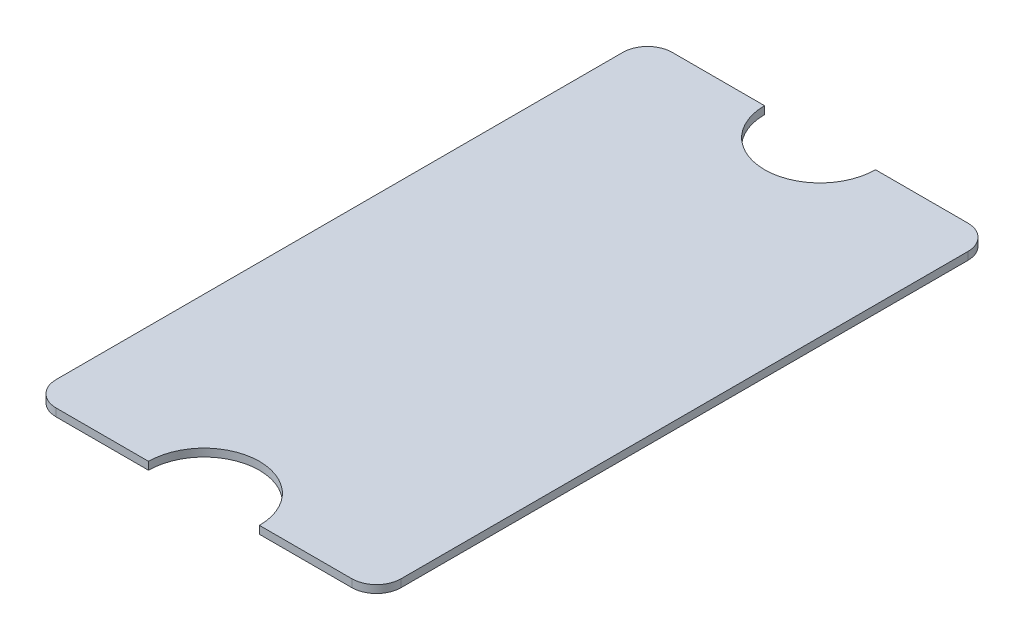
ISO-10303-21;
HEADER;
FILE_DESCRIPTION(('STEP AP214'),'2;1');
FILE_NAME('part.step','',(''),(''),'','','');
FILE_SCHEMA(('AUTOMOTIVE_DESIGN { 1 0 10303 214 1 1 1 1 }'));
ENDSEC;
DATA;
#1=APPLICATION_CONTEXT('core data for automotive mechanical design processes');
#2=APPLICATION_PROTOCOL_DEFINITION('international standard','automotive_design',2000,#1);
#3=PRODUCT_CONTEXT('',#1,'mechanical');
#4=PRODUCT('Part','Part','',(#3));
#5=PRODUCT_RELATED_PRODUCT_CATEGORY('part','',(#4));
#6=PRODUCT_DEFINITION_FORMATION('','',#4);
#7=PRODUCT_DEFINITION_CONTEXT('part definition',#1,'design');
#8=PRODUCT_DEFINITION('design','',#6,#7);
#9=PRODUCT_DEFINITION_SHAPE('','',#8);
#10=(LENGTH_UNIT() NAMED_UNIT(*) SI_UNIT(.MILLI.,.METRE.));
#11=(NAMED_UNIT(*) PLANE_ANGLE_UNIT() SI_UNIT($,.RADIAN.));
#12=(NAMED_UNIT(*) SI_UNIT($,.STERADIAN.) SOLID_ANGLE_UNIT());
#13=UNCERTAINTY_MEASURE_WITH_UNIT(LENGTH_MEASURE(1.E-05),#10,'distance_accuracy_value','');
#14=(GEOMETRIC_REPRESENTATION_CONTEXT(3) GLOBAL_UNCERTAINTY_ASSIGNED_CONTEXT((#13)) GLOBAL_UNIT_ASSIGNED_CONTEXT((#10,
#11,#12)) REPRESENTATION_CONTEXT('',''));
#15=CARTESIAN_POINT('',(0.,0.,0.));
#16=DIRECTION('',(0.,0.,1.));
#17=DIRECTION('',(1.,0.,0.));
#18=AXIS2_PLACEMENT_3D('',#15,#16,#17);
#19=CARTESIAN_POINT('',(0.601078804943356,-0.63,0.));
#20=DIRECTION('',(0.,1.,0.));
#21=DIRECTION('',(0.,0.,1.));
#22=AXIS2_PLACEMENT_3D('',#19,#20,#21);
#23=CYLINDRICAL_SURFACE('',#22,4.5);
#24=CARTESIAN_POINT('',(0.601078804943356,0.,0.));
#25=DIRECTION('',(0.,1.,0.));
#26=DIRECTION('',(0.,0.,1.));
#27=AXIS2_PLACEMENT_3D('',#24,#25,#26);
#28=CIRCLE('',#27,4.5);
#29=CARTESIAN_POINT('',(5.10107880494336,0.,-1.01156062692898E-13));
#30=VERTEX_POINT('',#29);
#31=CARTESIAN_POINT('',(-3.89892119505664,0.,0.));
#32=VERTEX_POINT('',#31);
#33=EDGE_CURVE('E169',#30,#32,#28,.T.);
#34=ORIENTED_EDGE('',*,*,#33,.T.);
#35=DIRECTION('',(0.,1.,0.));
#36=VECTOR('',#35,1.);
#37=CARTESIAN_POINT('',(-3.89892119505664,-0.63,0.));
#38=LINE('',#37,#36);
#39=CARTESIAN_POINT('',(-3.89892119505664,-0.63,0.));
#40=VERTEX_POINT('',#39);
#41=EDGE_CURVE('E152',#40,#32,#38,.T.);
#42=ORIENTED_EDGE('',*,*,#41,.F.);
#43=CARTESIAN_POINT('',(0.601078804943356,-0.63,0.));
#44=DIRECTION('',(0.,1.,0.));
#45=DIRECTION('',(0.,0.,1.));
#46=AXIS2_PLACEMENT_3D('',#43,#44,#45);
#47=CIRCLE('',#46,4.5);
#48=CARTESIAN_POINT('',(5.10107880494336,-0.63,-1.01156062692898E-13));
#49=VERTEX_POINT('',#48);
#50=EDGE_CURVE('E133',#49,#40,#47,.T.);
#51=ORIENTED_EDGE('',*,*,#50,.F.);
#52=DIRECTION('',(0.,1.,0.));
#53=VECTOR('',#52,1.);
#54=CARTESIAN_POINT('',(5.10107880494336,-0.63,-1.01156062692898E-13));
#55=LINE('',#54,#53);
#56=EDGE_CURVE('E142',#49,#30,#55,.T.);
#57=ORIENTED_EDGE('',*,*,#56,.T.);
#58=EDGE_LOOP('',(#34,#42,#51,#57));
#59=FACE_BOUND('',#58,.T.);
#60=ADVANCED_FACE('F40',(#59),#23,.F.);
#61=CARTESIAN_POINT('',(0.,-0.63,0.));
#62=DIRECTION('',(0.,0.,-1.));
#63=DIRECTION('',(-1.,0.,0.));
#64=AXIS2_PLACEMENT_3D('',#61,#62,#63);
#65=PLANE('',#64);
#66=DIRECTION('',(-1.,0.,0.));
#67=VECTOR('',#66,1.);
#68=CARTESIAN_POINT('',(0.,0.,0.));
#69=LINE('',#68,#67);
#70=CARTESIAN_POINT('',(-11.3989211950564,0.,0.));
#71=VERTEX_POINT('',#70);
#72=EDGE_CURVE('E153',#32,#71,#69,.T.);
#73=ORIENTED_EDGE('',*,*,#72,.T.);
#74=DIRECTION('',(0.,1.,0.));
#75=VECTOR('',#74,1.);
#76=CARTESIAN_POINT('',(-11.3989211950564,-0.63,0.));
#77=LINE('',#76,#75);
#78=CARTESIAN_POINT('',(-11.3989211950564,-0.63,0.));
#79=VERTEX_POINT('',#78);
#80=EDGE_CURVE('E200',#71,#79,#77,.F.);
#81=ORIENTED_EDGE('',*,*,#80,.T.);
#82=DIRECTION('',(-1.,0.,0.));
#83=VECTOR('',#82,1.);
#84=CARTESIAN_POINT('',(0.,-0.63,0.));
#85=LINE('',#84,#83);
#86=EDGE_CURVE('E140',#40,#79,#85,.T.);
#87=ORIENTED_EDGE('',*,*,#86,.F.);
#88=ORIENTED_EDGE('',*,*,#41,.T.);
#89=EDGE_LOOP('',(#73,#81,#87,#88));
#90=FACE_BOUND('',#89,.T.);
#91=ADVANCED_FACE('F242',(#90),#65,.F.);
#92=CARTESIAN_POINT('',(-13.3989211950564,-0.63,0.));
#93=DIRECTION('',(-1.,0.,0.));
#94=DIRECTION('',(0.,0.,1.));
#95=AXIS2_PLACEMENT_3D('',#92,#93,#94);
#96=PLANE('',#95);
#97=DIRECTION('',(0.,0.,1.));
#98=VECTOR('',#97,1.);
#99=CARTESIAN_POINT('',(-13.3989211950564,-0.63,0.));
#100=LINE('',#99,#98);
#101=CARTESIAN_POINT('',(-13.3989211950564,-0.63,-48.));
#102=VERTEX_POINT('',#101);
#103=CARTESIAN_POINT('',(-13.3989211950564,-0.63,-2.00000000000001));
#104=VERTEX_POINT('',#103);
#105=EDGE_CURVE('E166',#102,#104,#100,.T.);
#106=ORIENTED_EDGE('',*,*,#105,.T.);
#107=DIRECTION('',(0.,1.,0.));
#108=VECTOR('',#107,1.);
#109=CARTESIAN_POINT('',(-13.3989211950564,0.,-2.00000000000001));
#110=LINE('',#109,#108);
#111=CARTESIAN_POINT('',(-13.3989211950564,0.,-2.00000000000001));
#112=VERTEX_POINT('',#111);
#113=EDGE_CURVE('E189',#104,#112,#110,.T.);
#114=ORIENTED_EDGE('',*,*,#113,.T.);
#115=DIRECTION('',(0.,0.,1.));
#116=VECTOR('',#115,1.);
#117=CARTESIAN_POINT('',(-13.3989211950564,0.,0.));
#118=LINE('',#117,#116);
#119=CARTESIAN_POINT('',(-13.3989211950564,0.,-48.));
#120=VERTEX_POINT('',#119);
#121=EDGE_CURVE('E156',#120,#112,#118,.T.);
#122=ORIENTED_EDGE('',*,*,#121,.F.);
#123=DIRECTION('',(0.,1.,0.));
#124=VECTOR('',#123,1.);
#125=CARTESIAN_POINT('',(-13.3989211950564,-0.63,-48.));
#126=LINE('',#125,#124);
#127=EDGE_CURVE('E183',#120,#102,#126,.F.);
#128=ORIENTED_EDGE('',*,*,#127,.T.);
#129=EDGE_LOOP('',(#106,#114,#122,#128));
#130=FACE_BOUND('',#129,.T.);
#131=ADVANCED_FACE('F247',(#130),#96,.T.);
#132=CARTESIAN_POINT('',(0.,-0.63,-50.));
#133=DIRECTION('',(0.,0.,-1.));
#134=DIRECTION('',(-1.,0.,0.));
#135=AXIS2_PLACEMENT_3D('',#132,#133,#134);
#136=PLANE('',#135);
#137=DIRECTION('',(-1.,0.,0.));
#138=VECTOR('',#137,1.);
#139=CARTESIAN_POINT('',(0.,-0.63,-50.));
#140=LINE('',#139,#138);
#141=CARTESIAN_POINT('',(-3.89892119505644,-0.63,-50.));
#142=VERTEX_POINT('',#141);
#143=CARTESIAN_POINT('',(-11.3989211950564,-0.63,-50.));
#144=VERTEX_POINT('',#143);
#145=EDGE_CURVE('E163',#142,#144,#140,.T.);
#146=ORIENTED_EDGE('',*,*,#145,.T.);
#147=DIRECTION('',(0.,1.,0.));
#148=VECTOR('',#147,1.);
#149=CARTESIAN_POINT('',(-11.3989211950564,-0.63,-50.));
#150=LINE('',#149,#148);
#151=CARTESIAN_POINT('',(-11.3989211950564,0.,-50.));
#152=VERTEX_POINT('',#151);
#153=EDGE_CURVE('E11',#144,#152,#150,.T.);
#154=ORIENTED_EDGE('',*,*,#153,.T.);
#155=DIRECTION('',(-1.,0.,0.));
#156=VECTOR('',#155,1.);
#157=CARTESIAN_POINT('',(0.,0.,-50.));
#158=LINE('',#157,#156);
#159=CARTESIAN_POINT('',(-3.89892119505644,0.,-50.));
#160=VERTEX_POINT('',#159);
#161=EDGE_CURVE('E177',#160,#152,#158,.T.);
#162=ORIENTED_EDGE('',*,*,#161,.F.);
#163=DIRECTION('',(0.,1.,0.));
#164=VECTOR('',#163,1.);
#165=CARTESIAN_POINT('',(-3.89892119505644,-0.63,-50.));
#166=LINE('',#165,#164);
#167=EDGE_CURVE('E184',#142,#160,#166,.T.);
#168=ORIENTED_EDGE('',*,*,#167,.F.);
#169=EDGE_LOOP('',(#146,#154,#162,#168));
#170=FACE_BOUND('',#169,.T.);
#171=ADVANCED_FACE('F256',(#170),#136,.T.);
#172=CARTESIAN_POINT('',(0.601078804943561,-0.63,-50.));
#173=DIRECTION('',(0.,1.,0.));
#174=DIRECTION('',(0.,0.,1.));
#175=AXIS2_PLACEMENT_3D('',#172,#173,#174);
#176=CYLINDRICAL_SURFACE('',#175,4.5);
#177=CARTESIAN_POINT('',(0.601078804943561,0.,-50.));
#178=DIRECTION('',(0.,1.,0.));
#179=DIRECTION('',(0.,0.,1.));
#180=AXIS2_PLACEMENT_3D('',#177,#178,#179);
#181=CIRCLE('',#180,4.5);
#182=CARTESIAN_POINT('',(5.10107880494356,0.,-50.));
#183=VERTEX_POINT('',#182);
#184=EDGE_CURVE('E176',#160,#183,#181,.T.);
#185=ORIENTED_EDGE('',*,*,#184,.T.);
#186=DIRECTION('',(0.,1.,0.));
#187=VECTOR('',#186,1.);
#188=CARTESIAN_POINT('',(5.10107880494356,-0.63,-50.));
#189=LINE('',#188,#187);
#190=CARTESIAN_POINT('',(5.10107880494356,-0.63,-50.));
#191=VERTEX_POINT('',#190);
#192=EDGE_CURVE('E149',#191,#183,#189,.T.);
#193=ORIENTED_EDGE('',*,*,#192,.F.);
#194=CARTESIAN_POINT('',(0.601078804943561,-0.63,-50.));
#195=DIRECTION('',(0.,1.,0.));
#196=DIRECTION('',(0.,0.,1.));
#197=AXIS2_PLACEMENT_3D('',#194,#195,#196);
#198=CIRCLE('',#197,4.5);
#199=EDGE_CURVE('E162',#142,#191,#198,.T.);
#200=ORIENTED_EDGE('',*,*,#199,.F.);
#201=ORIENTED_EDGE('',*,*,#167,.T.);
#202=EDGE_LOOP('',(#185,#193,#200,#201));
#203=FACE_BOUND('',#202,.T.);
#204=ADVANCED_FACE('F253',(#203),#176,.F.);
#205=CARTESIAN_POINT('',(12.6010788049436,0.,-50.));
#206=VERTEX_POINT('',#205);
#207=EDGE_CURVE('E174',#206,#183,#158,.T.);
#208=ORIENTED_EDGE('',*,*,#207,.F.);
#209=DIRECTION('',(0.,1.,0.));
#210=VECTOR('',#209,1.);
#211=CARTESIAN_POINT('',(12.6010788049436,-0.63,-50.));
#212=LINE('',#211,#210);
#213=CARTESIAN_POINT('',(12.6010788049436,-0.63,-50.));
#214=VERTEX_POINT('',#213);
#215=EDGE_CURVE('E48',#206,#214,#212,.F.);
#216=ORIENTED_EDGE('',*,*,#215,.T.);
#217=EDGE_CURVE('E160',#214,#191,#140,.T.);
#218=ORIENTED_EDGE('',*,*,#217,.T.);
#219=ORIENTED_EDGE('',*,*,#192,.T.);
#220=EDGE_LOOP('',(#208,#216,#218,#219));
#221=FACE_BOUND('',#220,.T.);
#222=ADVANCED_FACE('F217',(#221),#136,.T.);
#223=CARTESIAN_POINT('',(14.6010788049436,-0.63,0.));
#224=DIRECTION('',(1.,0.,0.));
#225=DIRECTION('',(0.,0.,-1.));
#226=AXIS2_PLACEMENT_3D('',#223,#224,#225);
#227=PLANE('',#226);
#228=DIRECTION('',(0.,0.,-1.));
#229=VECTOR('',#228,1.);
#230=CARTESIAN_POINT('',(14.6010788049436,0.,0.));
#231=LINE('',#230,#229);
#232=CARTESIAN_POINT('',(14.6010788049436,0.,-2.00000000000014));
#233=VERTEX_POINT('',#232);
#234=CARTESIAN_POINT('',(14.6010788049436,0.,-48.));
#235=VERTEX_POINT('',#234);
#236=EDGE_CURVE('E171',#233,#235,#231,.T.);
#237=ORIENTED_EDGE('',*,*,#236,.F.);
#238=DIRECTION('',(0.,1.,0.));
#239=VECTOR('',#238,1.);
#240=CARTESIAN_POINT('',(14.6010788049436,-0.63,-2.00000000000014));
#241=LINE('',#240,#239);
#242=CARTESIAN_POINT('',(14.6010788049436,-0.63,-2.00000000000014));
#243=VERTEX_POINT('',#242);
#244=EDGE_CURVE('E213',#233,#243,#241,.F.);
#245=ORIENTED_EDGE('',*,*,#244,.T.);
#246=DIRECTION('',(0.,0.,-1.));
#247=VECTOR('',#246,1.);
#248=CARTESIAN_POINT('',(14.6010788049436,-0.63,0.));
#249=LINE('',#248,#247);
#250=CARTESIAN_POINT('',(14.6010788049436,-0.63,-48.));
#251=VERTEX_POINT('',#250);
#252=EDGE_CURVE('E138',#243,#251,#249,.T.);
#253=ORIENTED_EDGE('',*,*,#252,.T.);
#254=DIRECTION('',(0.,1.,0.));
#255=VECTOR('',#254,1.);
#256=CARTESIAN_POINT('',(14.6010788049436,-0.63,-48.));
#257=LINE('',#256,#255);
#258=EDGE_CURVE('E210',#251,#235,#257,.T.);
#259=ORIENTED_EDGE('',*,*,#258,.T.);
#260=EDGE_LOOP('',(#237,#245,#253,#259));
#261=FACE_BOUND('',#260,.T.);
#262=ADVANCED_FACE('F226',(#261),#227,.T.);
#263=CARTESIAN_POINT('',(12.6010788049436,-0.63,-1.41813644161106E-13));
#264=VERTEX_POINT('',#263);
#265=EDGE_CURVE('E128',#264,#49,#85,.T.);
#266=ORIENTED_EDGE('',*,*,#265,.F.);
#267=DIRECTION('',(0.,1.,0.));
#268=VECTOR('',#267,1.);
#269=CARTESIAN_POINT('',(12.6010788049436,0.,-1.41813644161106E-13));
#270=LINE('',#269,#268);
#271=CARTESIAN_POINT('',(12.6010788049436,0.,-1.41813644161106E-13));
#272=VERTEX_POINT('',#271);
#273=EDGE_CURVE('E208',#264,#272,#270,.T.);
#274=ORIENTED_EDGE('',*,*,#273,.T.);
#275=EDGE_CURVE('E145',#272,#30,#69,.T.);
#276=ORIENTED_EDGE('',*,*,#275,.T.);
#277=ORIENTED_EDGE('',*,*,#56,.F.);
#278=EDGE_LOOP('',(#266,#274,#276,#277));
#279=FACE_BOUND('',#278,.T.);
#280=ADVANCED_FACE('F143',(#279),#65,.F.);
#281=CARTESIAN_POINT('',(0.,-0.63,0.));
#282=DIRECTION('',(0.,1.,0.));
#283=DIRECTION('',(0.,0.,1.));
#284=AXIS2_PLACEMENT_3D('',#281,#282,#283);
#285=PLANE('',#284);
#286=ORIENTED_EDGE('',*,*,#86,.T.);
#287=CARTESIAN_POINT('',(-11.3989211950564,-0.63,-2.00000000000001));
#288=DIRECTION('',(0.,1.,0.));
#289=DIRECTION('',(0.,0.,1.));
#290=AXIS2_PLACEMENT_3D('',#287,#288,#289);
#291=CIRCLE('',#290,2.);
#292=EDGE_CURVE('E206',#79,#104,#291,.F.);
#293=ORIENTED_EDGE('',*,*,#292,.T.);
#294=ORIENTED_EDGE('',*,*,#105,.F.);
#295=CARTESIAN_POINT('',(-11.3989211950564,-0.63,-48.));
#296=DIRECTION('',(0.,1.,0.));
#297=DIRECTION('',(0.,0.,1.));
#298=AXIS2_PLACEMENT_3D('',#295,#296,#297);
#299=CIRCLE('',#298,2.);
#300=EDGE_CURVE('E202',#102,#144,#299,.F.);
#301=ORIENTED_EDGE('',*,*,#300,.T.);
#302=ORIENTED_EDGE('',*,*,#145,.F.);
#303=ORIENTED_EDGE('',*,*,#199,.T.);
#304=ORIENTED_EDGE('',*,*,#217,.F.);
#305=CARTESIAN_POINT('',(12.6010788049436,-0.63,-48.));
#306=DIRECTION('',(0.,1.,0.));
#307=DIRECTION('',(0.,0.,1.));
#308=AXIS2_PLACEMENT_3D('',#305,#306,#307);
#309=CIRCLE('',#308,2.);
#310=EDGE_CURVE('E61',#214,#251,#309,.F.);
#311=ORIENTED_EDGE('',*,*,#310,.T.);
#312=ORIENTED_EDGE('',*,*,#252,.F.);
#313=CARTESIAN_POINT('',(12.6010788049436,-0.63,-2.00000000000014));
#314=DIRECTION('',(0.,1.,0.));
#315=DIRECTION('',(0.,0.,1.));
#316=AXIS2_PLACEMENT_3D('',#313,#314,#315);
#317=CIRCLE('',#316,2.);
#318=EDGE_CURVE('E55',#243,#264,#317,.F.);
#319=ORIENTED_EDGE('',*,*,#318,.T.);
#320=ORIENTED_EDGE('',*,*,#265,.T.);
#321=ORIENTED_EDGE('',*,*,#50,.T.);
#322=EDGE_LOOP('',(#286,#293,#294,#301,#302,#303,#304,#311,#312,#319,#320,#321));
#323=FACE_BOUND('',#322,.T.);
#324=ADVANCED_FACE('F131',(#323),#285,.F.);
#325=CARTESIAN_POINT('',(0.,0.,0.));
#326=DIRECTION('',(0.,1.,0.));
#327=DIRECTION('',(0.,0.,1.));
#328=AXIS2_PLACEMENT_3D('',#325,#326,#327);
#329=PLANE('',#328);
#330=ORIENTED_EDGE('',*,*,#121,.T.);
#331=CARTESIAN_POINT('',(-11.3989211950564,0.,-2.00000000000001));
#332=DIRECTION('',(0.,1.,0.));
#333=DIRECTION('',(0.,0.,1.));
#334=AXIS2_PLACEMENT_3D('',#331,#332,#333);
#335=CIRCLE('',#334,2.);
#336=EDGE_CURVE('E198',#112,#71,#335,.T.);
#337=ORIENTED_EDGE('',*,*,#336,.T.);
#338=ORIENTED_EDGE('',*,*,#72,.F.);
#339=ORIENTED_EDGE('',*,*,#33,.F.);
#340=ORIENTED_EDGE('',*,*,#275,.F.);
#341=CARTESIAN_POINT('',(12.6010788049436,0.,-2.00000000000014));
#342=DIRECTION('',(0.,1.,0.));
#343=DIRECTION('',(0.,0.,1.));
#344=AXIS2_PLACEMENT_3D('',#341,#342,#343);
#345=CIRCLE('',#344,2.);
#346=EDGE_CURVE('E196',#272,#233,#345,.T.);
#347=ORIENTED_EDGE('',*,*,#346,.T.);
#348=ORIENTED_EDGE('',*,*,#236,.T.);
#349=CARTESIAN_POINT('',(12.6010788049436,0.,-48.));
#350=DIRECTION('',(0.,1.,0.));
#351=DIRECTION('',(0.,0.,1.));
#352=AXIS2_PLACEMENT_3D('',#349,#350,#351);
#353=CIRCLE('',#352,2.);
#354=EDGE_CURVE('E194',#235,#206,#353,.T.);
#355=ORIENTED_EDGE('',*,*,#354,.T.);
#356=ORIENTED_EDGE('',*,*,#207,.T.);
#357=ORIENTED_EDGE('',*,*,#184,.F.);
#358=ORIENTED_EDGE('',*,*,#161,.T.);
#359=CARTESIAN_POINT('',(-11.3989211950564,0.,-48.));
#360=DIRECTION('',(0.,1.,0.));
#361=DIRECTION('',(0.,0.,1.));
#362=AXIS2_PLACEMENT_3D('',#359,#360,#361);
#363=CIRCLE('',#362,2.);
#364=EDGE_CURVE('E192',#152,#120,#363,.T.);
#365=ORIENTED_EDGE('',*,*,#364,.T.);
#366=EDGE_LOOP('',(#330,#337,#338,#339,#340,#347,#348,#355,#356,#357,#358,#365));
#367=FACE_BOUND('',#366,.T.);
#368=ADVANCED_FACE('F229',(#367),#329,.T.);
#369=CARTESIAN_POINT('',(-11.3989211950564,-0.63,-2.00000000000001));
#370=DIRECTION('',(0.,-1.,0.));
#371=DIRECTION('',(0.,0.,-1.));
#372=AXIS2_PLACEMENT_3D('',#369,#370,#371);
#373=CYLINDRICAL_SURFACE('',#372,2.);
#374=ORIENTED_EDGE('',*,*,#292,.F.);
#375=ORIENTED_EDGE('',*,*,#80,.F.);
#376=ORIENTED_EDGE('',*,*,#336,.F.);
#377=ORIENTED_EDGE('',*,*,#113,.F.);
#378=EDGE_LOOP('',(#374,#375,#376,#377));
#379=FACE_BOUND('',#378,.T.);
#380=ADVANCED_FACE('F233',(#379),#373,.T.);
#381=CARTESIAN_POINT('',(12.6010788049436,-0.63,-2.00000000000014));
#382=DIRECTION('',(0.,-1.,0.));
#383=DIRECTION('',(0.,0.,-1.));
#384=AXIS2_PLACEMENT_3D('',#381,#382,#383);
#385=CYLINDRICAL_SURFACE('',#384,2.);
#386=ORIENTED_EDGE('',*,*,#318,.F.);
#387=ORIENTED_EDGE('',*,*,#244,.F.);
#388=ORIENTED_EDGE('',*,*,#346,.F.);
#389=ORIENTED_EDGE('',*,*,#273,.F.);
#390=EDGE_LOOP('',(#386,#387,#388,#389));
#391=FACE_BOUND('',#390,.T.);
#392=ADVANCED_FACE('F231',(#391),#385,.T.);
#393=CARTESIAN_POINT('',(12.6010788049436,-0.63,-48.));
#394=DIRECTION('',(0.,1.,0.));
#395=DIRECTION('',(0.,0.,1.));
#396=AXIS2_PLACEMENT_3D('',#393,#394,#395);
#397=CYLINDRICAL_SURFACE('',#396,2.);
#398=ORIENTED_EDGE('',*,*,#310,.F.);
#399=ORIENTED_EDGE('',*,*,#215,.F.);
#400=ORIENTED_EDGE('',*,*,#354,.F.);
#401=ORIENTED_EDGE('',*,*,#258,.F.);
#402=EDGE_LOOP('',(#398,#399,#400,#401));
#403=FACE_BOUND('',#402,.T.);
#404=ADVANCED_FACE('F223',(#403),#397,.T.);
#405=CARTESIAN_POINT('',(-11.3989211950564,-0.63,-48.));
#406=DIRECTION('',(0.,1.,0.));
#407=DIRECTION('',(0.,0.,1.));
#408=AXIS2_PLACEMENT_3D('',#405,#406,#407);
#409=CYLINDRICAL_SURFACE('',#408,2.);
#410=ORIENTED_EDGE('',*,*,#300,.F.);
#411=ORIENTED_EDGE('',*,*,#127,.F.);
#412=ORIENTED_EDGE('',*,*,#364,.F.);
#413=ORIENTED_EDGE('',*,*,#153,.F.);
#414=EDGE_LOOP('',(#410,#411,#412,#413));
#415=FACE_BOUND('',#414,.T.);
#416=ADVANCED_FACE('F42',(#415),#409,.T.);
#417=CLOSED_SHELL('',(#60,#91,#131,#171,#204,#222,#262,#280,#324,#368,#380,#392,#404,#416));
#418=MANIFOLD_SOLID_BREP('B2',#417);
#419=ADVANCED_BREP_SHAPE_REPRESENTATION('',(#18,#418),#14);
#420=SHAPE_DEFINITION_REPRESENTATION(#9,#419);
ENDSEC;
END-ISO-10303-21;
